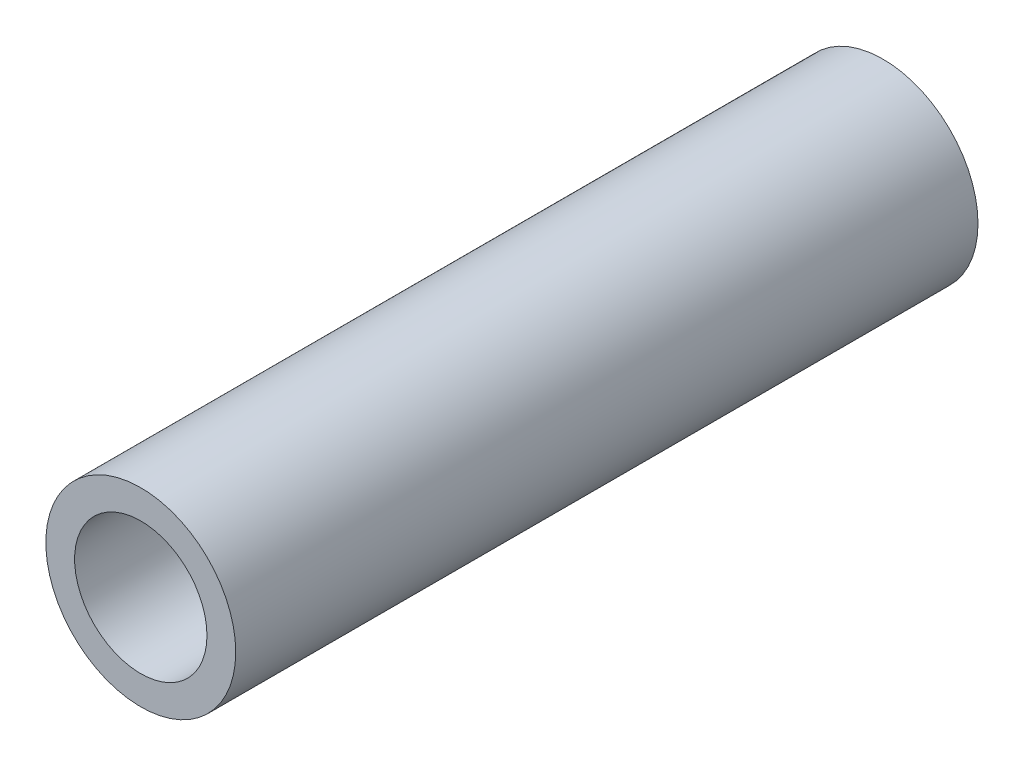
ISO-10303-21;
HEADER;
FILE_DESCRIPTION(('STEP AP214'),'2;1');
FILE_NAME('part.step','',(''),(''),'','','');
FILE_SCHEMA(('AUTOMOTIVE_DESIGN { 1 0 10303 214 1 1 1 1 }'));
ENDSEC;
DATA;
#1=APPLICATION_CONTEXT('core data for automotive mechanical design processes');
#2=APPLICATION_PROTOCOL_DEFINITION('international standard','automotive_design',2000,#1);
#3=PRODUCT_CONTEXT('',#1,'mechanical');
#4=PRODUCT('Part','Part','',(#3));
#5=PRODUCT_RELATED_PRODUCT_CATEGORY('part','',(#4));
#6=PRODUCT_DEFINITION_FORMATION('','',#4);
#7=PRODUCT_DEFINITION_CONTEXT('part definition',#1,'design');
#8=PRODUCT_DEFINITION('design','',#6,#7);
#9=PRODUCT_DEFINITION_SHAPE('','',#8);
#10=(LENGTH_UNIT() NAMED_UNIT(*) SI_UNIT(.MILLI.,.METRE.));
#11=(NAMED_UNIT(*) PLANE_ANGLE_UNIT() SI_UNIT($,.RADIAN.));
#12=(NAMED_UNIT(*) SI_UNIT($,.STERADIAN.) SOLID_ANGLE_UNIT());
#13=UNCERTAINTY_MEASURE_WITH_UNIT(LENGTH_MEASURE(1.E-05),#10,'distance_accuracy_value','');
#14=(GEOMETRIC_REPRESENTATION_CONTEXT(3) GLOBAL_UNCERTAINTY_ASSIGNED_CONTEXT((#13)) GLOBAL_UNIT_ASSIGNED_CONTEXT((#10,
#11,#12)) REPRESENTATION_CONTEXT('',''));
#15=CARTESIAN_POINT('',(0.,0.,0.));
#16=DIRECTION('',(0.,0.,1.));
#17=DIRECTION('',(1.,0.,0.));
#18=AXIS2_PLACEMENT_3D('',#15,#16,#17);
#19=CARTESIAN_POINT('',(0.,0.,32.766));
#20=DIRECTION('',(0.,0.,1.));
#21=DIRECTION('',(1.,0.,0.));
#22=AXIS2_PLACEMENT_3D('',#19,#20,#21);
#23=PLANE('',#22);
#24=CARTESIAN_POINT('',(0.,0.,32.766));
#25=DIRECTION('',(0.,0.,1.));
#26=DIRECTION('',(1.,0.,0.));
#27=AXIS2_PLACEMENT_3D('',#24,#25,#26);
#28=CIRCLE('',#27,4.191);
#29=CARTESIAN_POINT('',(4.191,0.,32.766));
#30=VERTEX_POINT('',#29);
#31=EDGE_CURVE('E10',#30,#30,#28,.T.);
#32=ORIENTED_EDGE('',*,*,#31,.T.);
#33=EDGE_LOOP('',(#32));
#34=FACE_BOUND('',#33,.T.);
#35=CARTESIAN_POINT('',(0.,0.,32.766));
#36=DIRECTION('',(0.,0.,1.));
#37=DIRECTION('',(1.,0.,0.));
#38=AXIS2_PLACEMENT_3D('',#35,#36,#37);
#39=CIRCLE('',#38,2.921);
#40=CARTESIAN_POINT('',(2.921,0.,32.766));
#41=VERTEX_POINT('',#40);
#42=EDGE_CURVE('E56',#41,#41,#39,.T.);
#43=ORIENTED_EDGE('',*,*,#42,.F.);
#44=EDGE_LOOP('',(#43));
#45=FACE_BOUND('',#44,.T.);
#46=ADVANCED_FACE('F43',(#34,#45),#23,.T.);
#47=CARTESIAN_POINT('',(0.,0.,0.));
#48=DIRECTION('',(0.,0.,1.));
#49=DIRECTION('',(1.,0.,0.));
#50=AXIS2_PLACEMENT_3D('',#47,#48,#49);
#51=PLANE('',#50);
#52=CARTESIAN_POINT('',(0.,0.,0.));
#53=DIRECTION('',(0.,0.,1.));
#54=DIRECTION('',(1.,0.,0.));
#55=AXIS2_PLACEMENT_3D('',#52,#53,#54);
#56=CIRCLE('',#55,4.191);
#57=CARTESIAN_POINT('',(4.191,0.,0.));
#58=VERTEX_POINT('',#57);
#59=EDGE_CURVE('E47',#58,#58,#56,.T.);
#60=ORIENTED_EDGE('',*,*,#59,.F.);
#61=EDGE_LOOP('',(#60));
#62=FACE_BOUND('',#61,.T.);
#63=CARTESIAN_POINT('',(0.,0.,0.));
#64=DIRECTION('',(0.,0.,1.));
#65=DIRECTION('',(1.,0.,0.));
#66=AXIS2_PLACEMENT_3D('',#63,#64,#65);
#67=CIRCLE('',#66,2.921);
#68=CARTESIAN_POINT('',(2.921,0.,0.));
#69=VERTEX_POINT('',#68);
#70=EDGE_CURVE('E58',#69,#69,#67,.T.);
#71=ORIENTED_EDGE('',*,*,#70,.T.);
#72=EDGE_LOOP('',(#71));
#73=FACE_BOUND('',#72,.T.);
#74=ADVANCED_FACE('F70',(#62,#73),#51,.F.);
#75=CARTESIAN_POINT('',(0.,0.,32.766));
#76=DIRECTION('',(0.,0.,-1.));
#77=DIRECTION('',(-1.,0.,0.));
#78=AXIS2_PLACEMENT_3D('',#75,#76,#77);
#79=CYLINDRICAL_SURFACE('',#78,4.191);
#80=ORIENTED_EDGE('',*,*,#31,.F.);
#81=EDGE_LOOP('',(#80));
#82=FACE_BOUND('',#81,.T.);
#83=ORIENTED_EDGE('',*,*,#59,.T.);
#84=EDGE_LOOP('',(#83));
#85=FACE_BOUND('',#84,.T.);
#86=ADVANCED_FACE('F45',(#82,#85),#79,.T.);
#87=CARTESIAN_POINT('',(0.,0.,32.766));
#88=DIRECTION('',(0.,0.,-1.));
#89=DIRECTION('',(-1.,0.,0.));
#90=AXIS2_PLACEMENT_3D('',#87,#88,#89);
#91=CYLINDRICAL_SURFACE('',#90,2.921);
#92=ORIENTED_EDGE('',*,*,#42,.T.);
#93=EDGE_LOOP('',(#92));
#94=FACE_BOUND('',#93,.T.);
#95=ORIENTED_EDGE('',*,*,#70,.F.);
#96=EDGE_LOOP('',(#95));
#97=FACE_BOUND('',#96,.T.);
#98=ADVANCED_FACE('F66',(#94,#97),#91,.F.);
#99=CLOSED_SHELL('',(#46,#74,#86,#98));
#100=MANIFOLD_SOLID_BREP('B2',#99);
#101=ADVANCED_BREP_SHAPE_REPRESENTATION('',(#18,#100),#14);
#102=SHAPE_DEFINITION_REPRESENTATION(#9,#101);
ENDSEC;
END-ISO-10303-21;
